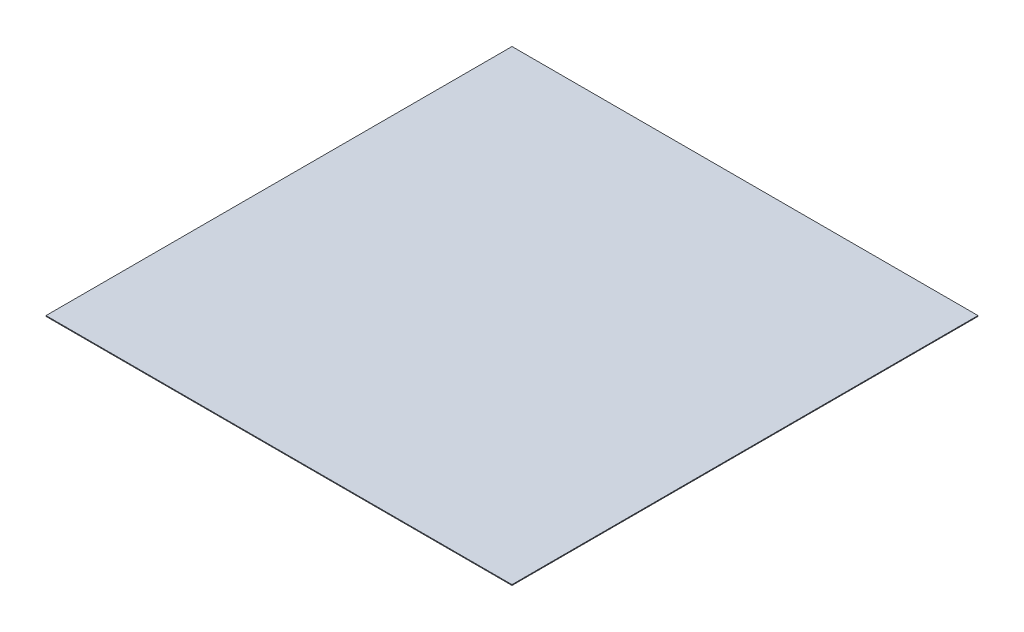
ISO-10303-21;
HEADER;
FILE_DESCRIPTION(('STEP AP214'),'2;1');
FILE_NAME('part.step','',(''),(''),'','','');
FILE_SCHEMA(('AUTOMOTIVE_DESIGN { 1 0 10303 214 1 1 1 1 }'));
ENDSEC;
DATA;
#1=APPLICATION_CONTEXT('core data for automotive mechanical design processes');
#2=APPLICATION_PROTOCOL_DEFINITION('international standard','automotive_design',2000,#1);
#3=PRODUCT_CONTEXT('',#1,'mechanical');
#4=PRODUCT('Part','Part','',(#3));
#5=PRODUCT_RELATED_PRODUCT_CATEGORY('part','',(#4));
#6=PRODUCT_DEFINITION_FORMATION('','',#4);
#7=PRODUCT_DEFINITION_CONTEXT('part definition',#1,'design');
#8=PRODUCT_DEFINITION('design','',#6,#7);
#9=PRODUCT_DEFINITION_SHAPE('','',#8);
#10=(LENGTH_UNIT() NAMED_UNIT(*) SI_UNIT(.MILLI.,.METRE.));
#11=(NAMED_UNIT(*) PLANE_ANGLE_UNIT() SI_UNIT($,.RADIAN.));
#12=(NAMED_UNIT(*) SI_UNIT($,.STERADIAN.) SOLID_ANGLE_UNIT());
#13=UNCERTAINTY_MEASURE_WITH_UNIT(LENGTH_MEASURE(1.E-05),#10,'distance_accuracy_value','');
#14=(GEOMETRIC_REPRESENTATION_CONTEXT(3) GLOBAL_UNCERTAINTY_ASSIGNED_CONTEXT((#13)) GLOBAL_UNIT_ASSIGNED_CONTEXT((#10,
#11,#12)) REPRESENTATION_CONTEXT('',''));
#15=CARTESIAN_POINT('',(0.,0.,0.));
#16=DIRECTION('',(0.,0.,1.));
#17=DIRECTION('',(1.,0.,0.));
#18=AXIS2_PLACEMENT_3D('',#15,#16,#17);
#19=CARTESIAN_POINT('',(15.,0.05,-15.));
#20=DIRECTION('',(-1.,0.,0.));
#21=DIRECTION('',(0.,0.,1.));
#22=AXIS2_PLACEMENT_3D('',#19,#20,#21);
#23=PLANE('',#22);
#24=DIRECTION('',(0.,0.,-1.));
#25=VECTOR('',#24,1.);
#26=CARTESIAN_POINT('',(15.,0.,-15.));
#27=LINE('',#26,#25);
#28=CARTESIAN_POINT('',(15.,0.,15.));
#29=VERTEX_POINT('',#28);
#30=CARTESIAN_POINT('',(15.,0.,-15.));
#31=VERTEX_POINT('',#30);
#32=EDGE_CURVE('E106',#29,#31,#27,.T.);
#33=ORIENTED_EDGE('',*,*,#32,.T.);
#34=DIRECTION('',(0.,-1.,0.));
#35=VECTOR('',#34,1.);
#36=CARTESIAN_POINT('',(15.,0.05,-15.));
#37=LINE('',#36,#35);
#38=CARTESIAN_POINT('',(15.,0.05,-15.));
#39=VERTEX_POINT('',#38);
#40=EDGE_CURVE('E11',#39,#31,#37,.T.);
#41=ORIENTED_EDGE('',*,*,#40,.F.);
#42=DIRECTION('',(0.,0.,-1.));
#43=VECTOR('',#42,1.);
#44=CARTESIAN_POINT('',(15.,0.05,-15.));
#45=LINE('',#44,#43);
#46=CARTESIAN_POINT('',(15.,0.05,15.));
#47=VERTEX_POINT('',#46);
#48=EDGE_CURVE('E94',#47,#39,#45,.T.);
#49=ORIENTED_EDGE('',*,*,#48,.F.);
#50=DIRECTION('',(0.,-1.,0.));
#51=VECTOR('',#50,1.);
#52=CARTESIAN_POINT('',(15.,0.05,15.));
#53=LINE('',#52,#51);
#54=EDGE_CURVE('E102',#47,#29,#53,.T.);
#55=ORIENTED_EDGE('',*,*,#54,.T.);
#56=EDGE_LOOP('',(#33,#41,#49,#55));
#57=FACE_BOUND('',#56,.T.);
#58=ADVANCED_FACE('F43',(#57),#23,.F.);
#59=CARTESIAN_POINT('',(-15.,0.05,-15.));
#60=DIRECTION('',(0.,0.,1.));
#61=DIRECTION('',(1.,0.,0.));
#62=AXIS2_PLACEMENT_3D('',#59,#60,#61);
#63=PLANE('',#62);
#64=DIRECTION('',(-1.,0.,0.));
#65=VECTOR('',#64,1.);
#66=CARTESIAN_POINT('',(-15.,0.,-15.));
#67=LINE('',#66,#65);
#68=CARTESIAN_POINT('',(-15.,0.,-15.));
#69=VERTEX_POINT('',#68);
#70=EDGE_CURVE('E98',#31,#69,#67,.T.);
#71=ORIENTED_EDGE('',*,*,#70,.T.);
#72=DIRECTION('',(0.,-1.,0.));
#73=VECTOR('',#72,1.);
#74=CARTESIAN_POINT('',(-15.,0.05,-15.));
#75=LINE('',#74,#73);
#76=CARTESIAN_POINT('',(-15.,0.05,-15.));
#77=VERTEX_POINT('',#76);
#78=EDGE_CURVE('E51',#77,#69,#75,.T.);
#79=ORIENTED_EDGE('',*,*,#78,.F.);
#80=DIRECTION('',(-1.,0.,0.));
#81=VECTOR('',#80,1.);
#82=CARTESIAN_POINT('',(-15.,0.05,-15.));
#83=LINE('',#82,#81);
#84=EDGE_CURVE('E89',#39,#77,#83,.T.);
#85=ORIENTED_EDGE('',*,*,#84,.F.);
#86=ORIENTED_EDGE('',*,*,#40,.T.);
#87=EDGE_LOOP('',(#71,#79,#85,#86));
#88=FACE_BOUND('',#87,.T.);
#89=ADVANCED_FACE('F97',(#88),#63,.F.);
#90=CARTESIAN_POINT('',(-15.,0.05,-15.));
#91=DIRECTION('',(1.,0.,0.));
#92=DIRECTION('',(0.,0.,-1.));
#93=AXIS2_PLACEMENT_3D('',#90,#91,#92);
#94=PLANE('',#93);
#95=DIRECTION('',(0.,0.,1.));
#96=VECTOR('',#95,1.);
#97=CARTESIAN_POINT('',(-15.,0.,-15.));
#98=LINE('',#97,#96);
#99=CARTESIAN_POINT('',(-15.,0.,15.));
#100=VERTEX_POINT('',#99);
#101=EDGE_CURVE('E76',#69,#100,#98,.T.);
#102=ORIENTED_EDGE('',*,*,#101,.T.);
#103=DIRECTION('',(0.,-1.,0.));
#104=VECTOR('',#103,1.);
#105=CARTESIAN_POINT('',(-15.,0.05,15.));
#106=LINE('',#105,#104);
#107=CARTESIAN_POINT('',(-15.,0.05,15.));
#108=VERTEX_POINT('',#107);
#109=EDGE_CURVE('E99',#108,#100,#106,.T.);
#110=ORIENTED_EDGE('',*,*,#109,.F.);
#111=DIRECTION('',(0.,0.,1.));
#112=VECTOR('',#111,1.);
#113=CARTESIAN_POINT('',(-15.,0.05,-15.));
#114=LINE('',#113,#112);
#115=EDGE_CURVE('E92',#77,#108,#114,.T.);
#116=ORIENTED_EDGE('',*,*,#115,.F.);
#117=ORIENTED_EDGE('',*,*,#78,.T.);
#118=EDGE_LOOP('',(#102,#110,#116,#117));
#119=FACE_BOUND('',#118,.T.);
#120=ADVANCED_FACE('F100',(#119),#94,.F.);
#121=CARTESIAN_POINT('',(-15.,0.05,15.));
#122=DIRECTION('',(0.,0.,-1.));
#123=DIRECTION('',(-1.,0.,0.));
#124=AXIS2_PLACEMENT_3D('',#121,#122,#123);
#125=PLANE('',#124);
#126=DIRECTION('',(1.,0.,0.));
#127=VECTOR('',#126,1.);
#128=CARTESIAN_POINT('',(-15.,0.,15.));
#129=LINE('',#128,#127);
#130=EDGE_CURVE('E82',#100,#29,#129,.T.);
#131=ORIENTED_EDGE('',*,*,#130,.T.);
#132=ORIENTED_EDGE('',*,*,#54,.F.);
#133=DIRECTION('',(1.,0.,0.));
#134=VECTOR('',#133,1.);
#135=CARTESIAN_POINT('',(-15.,0.05,15.));
#136=LINE('',#135,#134);
#137=EDGE_CURVE('E59',#108,#47,#136,.T.);
#138=ORIENTED_EDGE('',*,*,#137,.F.);
#139=ORIENTED_EDGE('',*,*,#109,.T.);
#140=EDGE_LOOP('',(#131,#132,#138,#139));
#141=FACE_BOUND('',#140,.T.);
#142=ADVANCED_FACE('F113',(#141),#125,.F.);
#143=CARTESIAN_POINT('',(0.,0.05,0.));
#144=DIRECTION('',(0.,1.,0.));
#145=DIRECTION('',(0.,0.,1.));
#146=AXIS2_PLACEMENT_3D('',#143,#144,#145);
#147=PLANE('',#146);
#148=ORIENTED_EDGE('',*,*,#48,.T.);
#149=ORIENTED_EDGE('',*,*,#84,.T.);
#150=ORIENTED_EDGE('',*,*,#115,.T.);
#151=ORIENTED_EDGE('',*,*,#137,.T.);
#152=EDGE_LOOP('',(#148,#149,#150,#151));
#153=FACE_BOUND('',#152,.T.);
#154=ADVANCED_FACE('F90',(#153),#147,.T.);
#155=CARTESIAN_POINT('',(0.,0.,0.));
#156=DIRECTION('',(0.,1.,0.));
#157=DIRECTION('',(0.,0.,1.));
#158=AXIS2_PLACEMENT_3D('',#155,#156,#157);
#159=PLANE('',#158);
#160=ORIENTED_EDGE('',*,*,#32,.F.);
#161=ORIENTED_EDGE('',*,*,#130,.F.);
#162=ORIENTED_EDGE('',*,*,#101,.F.);
#163=ORIENTED_EDGE('',*,*,#70,.F.);
#164=EDGE_LOOP('',(#160,#161,#162,#163));
#165=FACE_BOUND('',#164,.T.);
#166=ADVANCED_FACE('F116',(#165),#159,.F.);
#167=CLOSED_SHELL('',(#58,#89,#120,#142,#154,#166));
#168=MANIFOLD_SOLID_BREP('B2',#167);
#169=ADVANCED_BREP_SHAPE_REPRESENTATION('',(#18,#168),#14);
#170=SHAPE_DEFINITION_REPRESENTATION(#9,#169);
ENDSEC;
END-ISO-10303-21;
